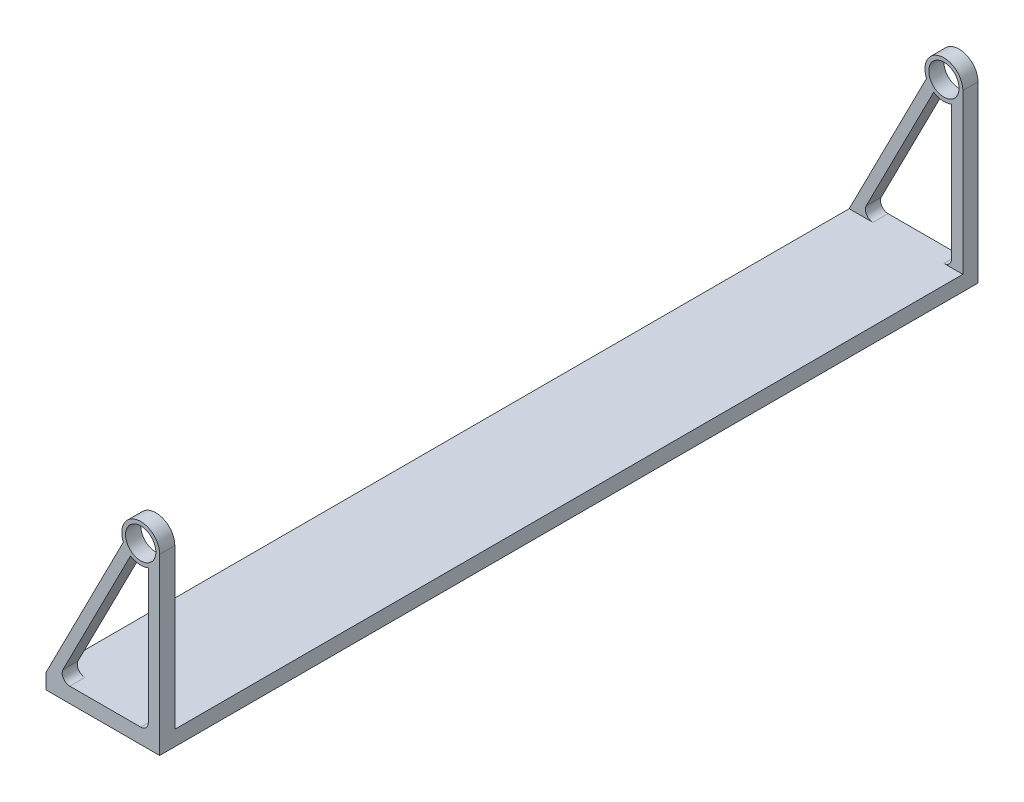
ISO-10303-21;
HEADER;
FILE_DESCRIPTION(('STEP AP214'),'2;1');
FILE_NAME('part.step','',(''),(''),'','','');
FILE_SCHEMA(('AUTOMOTIVE_DESIGN { 1 0 10303 214 1 1 1 1 }'));
ENDSEC;
DATA;
#1=APPLICATION_CONTEXT('core data for automotive mechanical design processes');
#2=APPLICATION_PROTOCOL_DEFINITION('international standard','automotive_design',2000,#1);
#3=PRODUCT_CONTEXT('',#1,'mechanical');
#4=PRODUCT('Part','Part','',(#3));
#5=PRODUCT_RELATED_PRODUCT_CATEGORY('part','',(#4));
#6=PRODUCT_DEFINITION_FORMATION('','',#4);
#7=PRODUCT_DEFINITION_CONTEXT('part definition',#1,'design');
#8=PRODUCT_DEFINITION('design','',#6,#7);
#9=PRODUCT_DEFINITION_SHAPE('','',#8);
#10=(LENGTH_UNIT() NAMED_UNIT(*) SI_UNIT(.MILLI.,.METRE.));
#11=(NAMED_UNIT(*) PLANE_ANGLE_UNIT() SI_UNIT($,.RADIAN.));
#12=(NAMED_UNIT(*) SI_UNIT($,.STERADIAN.) SOLID_ANGLE_UNIT());
#13=UNCERTAINTY_MEASURE_WITH_UNIT(LENGTH_MEASURE(1.E-05),#10,'distance_accuracy_value','');
#14=(GEOMETRIC_REPRESENTATION_CONTEXT(3) GLOBAL_UNCERTAINTY_ASSIGNED_CONTEXT((#13)) GLOBAL_UNIT_ASSIGNED_CONTEXT((#10,
#11,#12)) REPRESENTATION_CONTEXT('',''));
#15=CARTESIAN_POINT('',(0.,0.,0.));
#16=DIRECTION('',(0.,0.,1.));
#17=DIRECTION('',(1.,0.,0.));
#18=AXIS2_PLACEMENT_3D('',#15,#16,#17);
#19=CARTESIAN_POINT('',(0.,50.8,0.));
#20=DIRECTION('',(0.,-1.,0.));
#21=DIRECTION('',(0.,0.,-1.));
#22=AXIS2_PLACEMENT_3D('',#19,#20,#21);
#23=PLANE('',#22);
#24=DIRECTION('',(-1.,0.,0.));
#25=VECTOR('',#24,1.);
#26=CARTESIAN_POINT('',(0.,50.7999999999999,-1320.8));
#27=LINE('',#26,#25);
#28=CARTESIAN_POINT('',(190.5,50.8,-1320.8));
#29=VERTEX_POINT('',#28);
#30=CARTESIAN_POINT('',(127.,50.8,-1320.8));
#31=VERTEX_POINT('',#30);
#32=EDGE_CURVE('E218',#29,#31,#27,.T.);
#33=ORIENTED_EDGE('',*,*,#32,.T.);
#34=DIRECTION('',(0.,0.,-1.));
#35=VECTOR('',#34,1.);
#36=CARTESIAN_POINT('',(127.,50.8,0.));
#37=LINE('',#36,#35);
#38=CARTESIAN_POINT('',(127.,50.8,-1371.6));
#39=VERTEX_POINT('',#38);
#40=EDGE_CURVE('E326',#31,#39,#37,.T.);
#41=ORIENTED_EDGE('',*,*,#40,.T.);
#42=DIRECTION('',(-1.,0.,0.));
#43=VECTOR('',#42,1.);
#44=CARTESIAN_POINT('',(-190.5,50.8,-1371.6));
#45=LINE('',#44,#43);
#46=CARTESIAN_POINT('',(-110.90197212341,50.8,-1371.6));
#47=VERTEX_POINT('',#46);
#48=EDGE_CURVE('E187',#39,#47,#45,.T.);
#49=ORIENTED_EDGE('',*,*,#48,.T.);
#50=DIRECTION('',(0.,0.,-1.));
#51=VECTOR('',#50,1.);
#52=CARTESIAN_POINT('',(-110.90197212341,50.8,-1320.8));
#53=LINE('',#52,#51);
#54=CARTESIAN_POINT('',(-110.90197212341,50.8,-1320.8));
#55=VERTEX_POINT('',#54);
#56=EDGE_CURVE('E193',#47,#55,#53,.F.);
#57=ORIENTED_EDGE('',*,*,#56,.T.);
#58=DIRECTION('',(1.,0.,0.));
#59=VECTOR('',#58,1.);
#60=CARTESIAN_POINT('',(0.,50.8,-1320.8));
#61=LINE('',#60,#59);
#62=CARTESIAN_POINT('',(-190.5,50.8,-1320.8));
#63=VERTEX_POINT('',#62);
#64=EDGE_CURVE('E190',#63,#55,#61,.T.);
#65=ORIENTED_EDGE('',*,*,#64,.F.);
#66=DIRECTION('',(0.,0.,1.));
#67=VECTOR('',#66,1.);
#68=CARTESIAN_POINT('',(-190.5,50.8,1371.6));
#69=LINE('',#68,#67);
#70=CARTESIAN_POINT('',(-190.5,50.8,1320.8));
#71=VERTEX_POINT('',#70);
#72=EDGE_CURVE('E176',#63,#71,#69,.T.);
#73=ORIENTED_EDGE('',*,*,#72,.T.);
#74=DIRECTION('',(1.,0.,0.));
#75=VECTOR('',#74,1.);
#76=CARTESIAN_POINT('',(0.,50.8,1320.8));
#77=LINE('',#76,#75);
#78=CARTESIAN_POINT('',(-110.90197212341,50.8,1320.8));
#79=VERTEX_POINT('',#78);
#80=EDGE_CURVE('E265',#71,#79,#77,.T.);
#81=ORIENTED_EDGE('',*,*,#80,.T.);
#82=DIRECTION('',(0.,0.,1.));
#83=VECTOR('',#82,1.);
#84=CARTESIAN_POINT('',(-110.90197212341,50.8,0.));
#85=LINE('',#84,#83);
#86=CARTESIAN_POINT('',(-110.90197212341,50.8,1371.6));
#87=VERTEX_POINT('',#86);
#88=EDGE_CURVE('E322',#79,#87,#85,.T.);
#89=ORIENTED_EDGE('',*,*,#88,.T.);
#90=DIRECTION('',(1.,0.,0.));
#91=VECTOR('',#90,1.);
#92=CARTESIAN_POINT('',(-190.5,50.8,1371.6));
#93=LINE('',#92,#91);
#94=CARTESIAN_POINT('',(127.,50.8,1371.6));
#95=VERTEX_POINT('',#94);
#96=EDGE_CURVE('E205',#87,#95,#93,.T.);
#97=ORIENTED_EDGE('',*,*,#96,.T.);
#98=DIRECTION('',(0.,0.,1.));
#99=VECTOR('',#98,1.);
#100=CARTESIAN_POINT('',(127.,50.8,1320.8));
#101=LINE('',#100,#99);
#102=CARTESIAN_POINT('',(127.,50.8,1320.8));
#103=VERTEX_POINT('',#102);
#104=EDGE_CURVE('E319',#95,#103,#101,.F.);
#105=ORIENTED_EDGE('',*,*,#104,.T.);
#106=DIRECTION('',(-1.,0.,0.));
#107=VECTOR('',#106,1.);
#108=CARTESIAN_POINT('',(0.,50.7999999999999,1320.8));
#109=LINE('',#108,#107);
#110=CARTESIAN_POINT('',(190.5,50.8,1320.8));
#111=VERTEX_POINT('',#110);
#112=EDGE_CURVE('E258',#111,#103,#109,.T.);
#113=ORIENTED_EDGE('',*,*,#112,.F.);
#114=DIRECTION('',(0.,0.,-1.));
#115=VECTOR('',#114,1.);
#116=CARTESIAN_POINT('',(190.5,50.8,1371.6));
#117=LINE('',#116,#115);
#118=EDGE_CURVE('E295',#111,#29,#117,.T.);
#119=ORIENTED_EDGE('',*,*,#118,.T.);
#120=EDGE_LOOP('',(#33,#41,#49,#57,#65,#73,#81,#89,#97,#105,#113,#119));
#121=FACE_BOUND('',#120,.T.);
#122=ADVANCED_FACE('F35',(#121),#23,.F.);
#123=CARTESIAN_POINT('',(190.5,50.8,1371.6));
#124=DIRECTION('',(-1.,0.,0.));
#125=DIRECTION('',(0.,0.,1.));
#126=AXIS2_PLACEMENT_3D('',#123,#124,#125);
#127=PLANE('',#126);
#128=DIRECTION('',(0.,0.,-1.));
#129=VECTOR('',#128,1.);
#130=CARTESIAN_POINT('',(190.5,0.,1371.6));
#131=LINE('',#130,#129);
#132=CARTESIAN_POINT('',(190.5,0.,1371.6));
#133=VERTEX_POINT('',#132);
#134=CARTESIAN_POINT('',(190.5,0.,-1371.6));
#135=VERTEX_POINT('',#134);
#136=EDGE_CURVE('E284',#133,#135,#131,.T.);
#137=ORIENTED_EDGE('',*,*,#136,.T.);
#138=DIRECTION('',(0.,-1.,0.));
#139=VECTOR('',#138,1.);
#140=CARTESIAN_POINT('',(190.5,50.8,-1371.6));
#141=LINE('',#140,#139);
#142=CARTESIAN_POINT('',(190.5,584.2,-1371.6));
#143=VERTEX_POINT('',#142);
#144=EDGE_CURVE('E316',#143,#135,#141,.T.);
#145=ORIENTED_EDGE('',*,*,#144,.F.);
#146=DIRECTION('',(0.,0.,-1.));
#147=VECTOR('',#146,1.);
#148=CARTESIAN_POINT('',(190.5,584.2,-1320.8));
#149=LINE('',#148,#147);
#150=CARTESIAN_POINT('',(190.5,584.2,-1320.8));
#151=VERTEX_POINT('',#150);
#152=EDGE_CURVE('E245',#151,#143,#149,.T.);
#153=ORIENTED_EDGE('',*,*,#152,.F.);
#154=DIRECTION('',(0.,1.,0.));
#155=VECTOR('',#154,1.);
#156=CARTESIAN_POINT('',(190.5,0.,-1320.8));
#157=LINE('',#156,#155);
#158=EDGE_CURVE('E212',#29,#151,#157,.T.);
#159=ORIENTED_EDGE('',*,*,#158,.F.);
#160=ORIENTED_EDGE('',*,*,#118,.F.);
#161=DIRECTION('',(0.,1.,0.));
#162=VECTOR('',#161,1.);
#163=CARTESIAN_POINT('',(190.5,0.,1320.8));
#164=LINE('',#163,#162);
#165=CARTESIAN_POINT('',(190.5,584.2,1320.8));
#166=VERTEX_POINT('',#165);
#167=EDGE_CURVE('E260',#111,#166,#164,.T.);
#168=ORIENTED_EDGE('',*,*,#167,.T.);
#169=DIRECTION('',(0.,0.,1.));
#170=VECTOR('',#169,1.);
#171=CARTESIAN_POINT('',(190.5,584.2,1320.8));
#172=LINE('',#171,#170);
#173=CARTESIAN_POINT('',(190.5,584.2,1371.6));
#174=VERTEX_POINT('',#173);
#175=EDGE_CURVE('E287',#166,#174,#172,.T.);
#176=ORIENTED_EDGE('',*,*,#175,.T.);
#177=DIRECTION('',(0.,-1.,0.));
#178=VECTOR('',#177,1.);
#179=CARTESIAN_POINT('',(190.5,50.8,1371.6));
#180=LINE('',#179,#178);
#181=EDGE_CURVE('E301',#174,#133,#180,.T.);
#182=ORIENTED_EDGE('',*,*,#181,.T.);
#183=EDGE_LOOP('',(#137,#145,#153,#159,#160,#168,#176,#182));
#184=FACE_BOUND('',#183,.T.);
#185=ADVANCED_FACE('F388',(#184),#127,.F.);
#186=CARTESIAN_POINT('',(-190.5,50.8,-1371.6));
#187=DIRECTION('',(0.,0.,1.));
#188=DIRECTION('',(1.,0.,0.));
#189=AXIS2_PLACEMENT_3D('',#186,#187,#188);
#190=PLANE('',#189);
#191=ORIENTED_EDGE('',*,*,#48,.F.);
#192=CARTESIAN_POINT('',(127.,76.2,-1371.6));
#193=DIRECTION('',(0.,0.,1.));
#194=DIRECTION('',(1.,0.,0.));
#195=AXIS2_PLACEMENT_3D('',#192,#193,#194);
#196=CIRCLE('',#195,25.4);
#197=CARTESIAN_POINT('',(152.4,76.2,-1371.6));
#198=VERTEX_POINT('',#197);
#199=EDGE_CURVE('E338',#39,#198,#196,.T.);
#200=ORIENTED_EDGE('',*,*,#199,.T.);
#201=DIRECTION('',(0.,1.,0.));
#202=VECTOR('',#201,1.);
#203=CARTESIAN_POINT('',(152.4,0.,-1371.6));
#204=LINE('',#203,#202);
#205=CARTESIAN_POINT('',(152.4,526.001288674061,-1371.6));
#206=VERTEX_POINT('',#205);
#207=EDGE_CURVE('E232',#198,#206,#204,.T.);
#208=ORIENTED_EDGE('',*,*,#207,.T.);
#209=CARTESIAN_POINT('',(127.,584.2,-1371.6));
#210=DIRECTION('',(0.,0.,1.));
#211=DIRECTION('',(1.,0.,0.));
#212=AXIS2_PLACEMENT_3D('',#209,#210,#211);
#213=CIRCLE('',#212,63.5);
#214=CARTESIAN_POINT('',(92.7668359761249,530.717848950192,-1371.6));
#215=VERTEX_POINT('',#214);
#216=EDGE_CURVE('E233',#215,#206,#213,.T.);
#217=ORIENTED_EDGE('',*,*,#216,.F.);
#218=DIRECTION('',(0.454927866871508,0.89052829036687,0.));
#219=VECTOR('',#218,1.);
#220=CARTESIAN_POINT('',(-141.439800602513,72.2547587481184,-1371.6));
#221=LINE('',#220,#219);
#222=CARTESIAN_POINT('',(-133.521390698729,87.7551678185363,-1371.6));
#223=VERTEX_POINT('',#222);
#224=EDGE_CURVE('E226',#223,#215,#221,.T.);
#225=ORIENTED_EDGE('',*,*,#224,.F.);
#226=CARTESIAN_POINT('',(-110.90197212341,76.2,-1371.6));
#227=DIRECTION('',(0.,0.,1.));
#228=DIRECTION('',(1.,0.,0.));
#229=AXIS2_PLACEMENT_3D('',#226,#227,#228);
#230=CIRCLE('',#229,25.4);
#231=EDGE_CURVE('E343',#223,#47,#230,.T.);
#232=ORIENTED_EDGE('',*,*,#231,.T.);
#233=EDGE_LOOP('',(#191,#200,#208,#217,#225,#232));
#234=FACE_BOUND('',#233,.T.);
#235=DIRECTION('',(-1.,0.,0.));
#236=VECTOR('',#235,1.);
#237=CARTESIAN_POINT('',(-190.5,0.,-1371.6));
#238=LINE('',#237,#236);
#239=CARTESIAN_POINT('',(-190.5,0.,-1371.6));
#240=VERTEX_POINT('',#239);
#241=EDGE_CURVE('E304',#135,#240,#238,.T.);
#242=ORIENTED_EDGE('',*,*,#241,.T.);
#243=DIRECTION('',(0.,-1.,0.));
#244=VECTOR('',#243,1.);
#245=CARTESIAN_POINT('',(-190.5,50.8,-1371.6));
#246=LINE('',#245,#244);
#247=CARTESIAN_POINT('',(-190.5,50.8,-1371.6));
#248=VERTEX_POINT('',#247);
#249=EDGE_CURVE('E314',#248,#240,#246,.T.);
#250=ORIENTED_EDGE('',*,*,#249,.F.);
#251=DIRECTION('',(0.454927866871508,0.89052829036687,0.));
#252=VECTOR('',#251,1.);
#253=CARTESIAN_POINT('',(-171.654648831969,87.6900645116334,-1371.6));
#254=LINE('',#253,#252);
#255=CARTESIAN_POINT('',(68.8989410420002,558.577413324197,-1371.6));
#256=VERTEX_POINT('',#255);
#257=EDGE_CURVE('E204',#248,#256,#254,.T.);
#258=ORIENTED_EDGE('',*,*,#257,.T.);
#259=EDGE_CURVE('E229',#143,#256,#213,.T.);
#260=ORIENTED_EDGE('',*,*,#259,.F.);
#261=ORIENTED_EDGE('',*,*,#144,.T.);
#262=EDGE_LOOP('',(#242,#250,#258,#260,#261));
#263=FACE_BOUND('',#262,.T.);
#264=CARTESIAN_POINT('',(127.,584.2,-1371.6));
#265=DIRECTION('',(0.,0.,1.));
#266=DIRECTION('',(1.,0.,0.));
#267=AXIS2_PLACEMENT_3D('',#264,#265,#266);
#268=CIRCLE('',#267,50.8);
#269=CARTESIAN_POINT('',(177.8,584.2,-1371.6));
#270=VERTEX_POINT('',#269);
#271=EDGE_CURVE('E235',#270,#270,#268,.T.);
#272=ORIENTED_EDGE('',*,*,#271,.T.);
#273=EDGE_LOOP('',(#272));
#274=FACE_BOUND('',#273,.T.);
#275=ADVANCED_FACE('F403',(#234,#263,#274),#190,.F.);
#276=CARTESIAN_POINT('',(-190.5,50.8,1371.6));
#277=DIRECTION('',(1.,0.,0.));
#278=DIRECTION('',(0.,0.,-1.));
#279=AXIS2_PLACEMENT_3D('',#276,#277,#278);
#280=PLANE('',#279);
#281=DIRECTION('',(0.,0.,1.));
#282=VECTOR('',#281,1.);
#283=CARTESIAN_POINT('',(-190.5,0.,1371.6));
#284=LINE('',#283,#282);
#285=CARTESIAN_POINT('',(-190.5,0.,1371.6));
#286=VERTEX_POINT('',#285);
#287=EDGE_CURVE('E306',#240,#286,#284,.T.);
#288=ORIENTED_EDGE('',*,*,#287,.T.);
#289=DIRECTION('',(0.,-1.,0.));
#290=VECTOR('',#289,1.);
#291=CARTESIAN_POINT('',(-190.5,50.8,1371.6));
#292=LINE('',#291,#290);
#293=CARTESIAN_POINT('',(-190.5,50.8,1371.6));
#294=VERTEX_POINT('',#293);
#295=EDGE_CURVE('E311',#294,#286,#292,.T.);
#296=ORIENTED_EDGE('',*,*,#295,.F.);
#297=DIRECTION('',(0.,0.,1.));
#298=VECTOR('',#297,1.);
#299=CARTESIAN_POINT('',(-190.5,50.8,1320.8));
#300=LINE('',#299,#298);
#301=EDGE_CURVE('E184',#71,#294,#300,.T.);
#302=ORIENTED_EDGE('',*,*,#301,.F.);
#303=ORIENTED_EDGE('',*,*,#72,.F.);
#304=EDGE_CURVE('E181',#248,#63,#69,.T.);
#305=ORIENTED_EDGE('',*,*,#304,.F.);
#306=ORIENTED_EDGE('',*,*,#249,.T.);
#307=EDGE_LOOP('',(#288,#296,#302,#303,#305,#306));
#308=FACE_BOUND('',#307,.T.);
#309=ADVANCED_FACE('F178',(#308),#280,.F.);
#310=CARTESIAN_POINT('',(-190.5,50.8,1371.6));
#311=DIRECTION('',(0.,0.,-1.));
#312=DIRECTION('',(-1.,0.,0.));
#313=AXIS2_PLACEMENT_3D('',#310,#311,#312);
#314=PLANE('',#313);
#315=DIRECTION('',(0.,1.,0.));
#316=VECTOR('',#315,1.);
#317=CARTESIAN_POINT('',(152.4,0.,1371.6));
#318=LINE('',#317,#316);
#319=CARTESIAN_POINT('',(152.4,76.2,1371.6));
#320=VERTEX_POINT('',#319);
#321=CARTESIAN_POINT('',(152.4,526.001288674061,1371.6));
#322=VERTEX_POINT('',#321);
#323=EDGE_CURVE('E275',#320,#322,#318,.T.);
#324=ORIENTED_EDGE('',*,*,#323,.F.);
#325=CARTESIAN_POINT('',(127.,76.2,1371.6));
#326=DIRECTION('',(0.,0.,-1.));
#327=DIRECTION('',(-1.,0.,0.));
#328=AXIS2_PLACEMENT_3D('',#325,#326,#327);
#329=CIRCLE('',#328,25.4);
#330=EDGE_CURVE('E43',#320,#95,#329,.T.);
#331=ORIENTED_EDGE('',*,*,#330,.T.);
#332=ORIENTED_EDGE('',*,*,#96,.F.);
#333=CARTESIAN_POINT('',(-110.90197212341,76.2,1371.6));
#334=DIRECTION('',(0.,0.,-1.));
#335=DIRECTION('',(-1.,0.,0.));
#336=AXIS2_PLACEMENT_3D('',#333,#334,#335);
#337=CIRCLE('',#336,25.4);
#338=CARTESIAN_POINT('',(-133.521390698729,87.7551678185363,1371.6));
#339=VERTEX_POINT('',#338);
#340=EDGE_CURVE('E347',#87,#339,#337,.T.);
#341=ORIENTED_EDGE('',*,*,#340,.T.);
#342=DIRECTION('',(0.454927866871508,0.89052829036687,0.));
#343=VECTOR('',#342,1.);
#344=CARTESIAN_POINT('',(-141.439800602513,72.2547587481184,1371.6));
#345=LINE('',#344,#343);
#346=CARTESIAN_POINT('',(92.7668359761249,530.717848950192,1371.6));
#347=VERTEX_POINT('',#346);
#348=EDGE_CURVE('E241',#339,#347,#345,.T.);
#349=ORIENTED_EDGE('',*,*,#348,.T.);
#350=CARTESIAN_POINT('',(127.,584.2,1371.6));
#351=DIRECTION('',(0.,0.,1.));
#352=DIRECTION('',(1.,0.,0.));
#353=AXIS2_PLACEMENT_3D('',#350,#351,#352);
#354=CIRCLE('',#353,63.5);
#355=EDGE_CURVE('E272',#347,#322,#354,.T.);
#356=ORIENTED_EDGE('',*,*,#355,.T.);
#357=EDGE_LOOP('',(#324,#331,#332,#341,#349,#356));
#358=FACE_BOUND('',#357,.T.);
#359=DIRECTION('',(1.,0.,0.));
#360=VECTOR('',#359,1.);
#361=CARTESIAN_POINT('',(-190.5,0.,1371.6));
#362=LINE('',#361,#360);
#363=EDGE_CURVE('E297',#286,#133,#362,.T.);
#364=ORIENTED_EDGE('',*,*,#363,.T.);
#365=ORIENTED_EDGE('',*,*,#181,.F.);
#366=CARTESIAN_POINT('',(68.8989410420002,558.577413324197,1371.6));
#367=VERTEX_POINT('',#366);
#368=EDGE_CURVE('E276',#174,#367,#354,.T.);
#369=ORIENTED_EDGE('',*,*,#368,.T.);
#370=DIRECTION('',(0.454927866871508,0.89052829036687,0.));
#371=VECTOR('',#370,1.);
#372=CARTESIAN_POINT('',(-171.654648831969,87.6900645116334,1371.6));
#373=LINE('',#372,#371);
#374=EDGE_CURVE('E278',#294,#367,#373,.T.);
#375=ORIENTED_EDGE('',*,*,#374,.F.);
#376=ORIENTED_EDGE('',*,*,#295,.T.);
#377=EDGE_LOOP('',(#364,#365,#369,#375,#376));
#378=FACE_BOUND('',#377,.T.);
#379=CARTESIAN_POINT('',(127.,584.2,1371.6));
#380=DIRECTION('',(0.,0.,1.));
#381=DIRECTION('',(1.,0.,0.));
#382=AXIS2_PLACEMENT_3D('',#379,#380,#381);
#383=CIRCLE('',#382,50.8);
#384=CARTESIAN_POINT('',(177.8,584.2,1371.6));
#385=VERTEX_POINT('',#384);
#386=EDGE_CURVE('E252',#385,#385,#383,.T.);
#387=ORIENTED_EDGE('',*,*,#386,.F.);
#388=EDGE_LOOP('',(#387));
#389=FACE_BOUND('',#388,.T.);
#390=ADVANCED_FACE('F354',(#358,#378,#389),#314,.F.);
#391=CARTESIAN_POINT('',(0.,0.,0.));
#392=DIRECTION('',(0.,-1.,0.));
#393=DIRECTION('',(0.,0.,-1.));
#394=AXIS2_PLACEMENT_3D('',#391,#392,#393);
#395=PLANE('',#394);
#396=ORIENTED_EDGE('',*,*,#136,.F.);
#397=ORIENTED_EDGE('',*,*,#363,.F.);
#398=ORIENTED_EDGE('',*,*,#287,.F.);
#399=ORIENTED_EDGE('',*,*,#241,.F.);
#400=EDGE_LOOP('',(#396,#397,#398,#399));
#401=FACE_BOUND('',#400,.T.);
#402=ADVANCED_FACE('F441',(#401),#395,.T.);
#403=CARTESIAN_POINT('',(-141.439800602513,72.2547587481184,1320.8));
#404=DIRECTION('',(0.89052829036687,-0.454927866871508,0.));
#405=DIRECTION('',(0.454927866871508,0.89052829036687,0.));
#406=AXIS2_PLACEMENT_3D('',#403,#404,#405);
#407=PLANE('',#406);
#408=ORIENTED_EDGE('',*,*,#348,.F.);
#409=DIRECTION('',(0.,0.,1.));
#410=VECTOR('',#409,1.);
#411=CARTESIAN_POINT('',(-133.521390698729,87.7551678185363,1320.8));
#412=LINE('',#411,#410);
#413=CARTESIAN_POINT('',(-133.521390698729,87.7551678185363,1320.8));
#414=VERTEX_POINT('',#413);
#415=EDGE_CURVE('E334',#339,#414,#412,.F.);
#416=ORIENTED_EDGE('',*,*,#415,.T.);
#417=DIRECTION('',(0.454927866871508,0.89052829036687,0.));
#418=VECTOR('',#417,1.);
#419=CARTESIAN_POINT('',(-141.439800602513,72.2547587481184,1320.8));
#420=LINE('',#419,#418);
#421=CARTESIAN_POINT('',(92.7668359761249,530.717848950192,1320.8));
#422=VERTEX_POINT('',#421);
#423=EDGE_CURVE('E249',#414,#422,#420,.T.);
#424=ORIENTED_EDGE('',*,*,#423,.T.);
#425=DIRECTION('',(0.,0.,1.));
#426=VECTOR('',#425,1.);
#427=CARTESIAN_POINT('',(92.7668359761249,530.717848950192,1320.8));
#428=LINE('',#427,#426);
#429=EDGE_CURVE('E270',#422,#347,#428,.T.);
#430=ORIENTED_EDGE('',*,*,#429,.T.);
#431=EDGE_LOOP('',(#408,#416,#424,#430));
#432=FACE_BOUND('',#431,.T.);
#433=ADVANCED_FACE('F371',(#432),#407,.T.);
#434=CARTESIAN_POINT('',(-171.654648831969,87.6900645116334,1320.8));
#435=DIRECTION('',(0.89052829036687,-0.454927866871507,0.));
#436=DIRECTION('',(0.454927866871508,0.89052829036687,0.));
#437=AXIS2_PLACEMENT_3D('',#434,#435,#436);
#438=PLANE('',#437);
#439=ORIENTED_EDGE('',*,*,#374,.T.);
#440=DIRECTION('',(0.,0.,1.));
#441=VECTOR('',#440,1.);
#442=CARTESIAN_POINT('',(68.8989410420002,558.577413324197,1320.8));
#443=LINE('',#442,#441);
#444=CARTESIAN_POINT('',(68.8989410420002,558.577413324197,1320.8));
#445=VERTEX_POINT('',#444);
#446=EDGE_CURVE('E285',#445,#367,#443,.T.);
#447=ORIENTED_EDGE('',*,*,#446,.F.);
#448=DIRECTION('',(0.454927866871508,0.89052829036687,0.));
#449=VECTOR('',#448,1.);
#450=CARTESIAN_POINT('',(-171.654648831969,87.6900645116334,1320.8));
#451=LINE('',#450,#449);
#452=EDGE_CURVE('E263',#71,#445,#451,.T.);
#453=ORIENTED_EDGE('',*,*,#452,.F.);
#454=ORIENTED_EDGE('',*,*,#301,.T.);
#455=EDGE_LOOP('',(#439,#447,#453,#454));
#456=FACE_BOUND('',#455,.T.);
#457=ADVANCED_FACE('F381',(#456),#438,.F.);
#458=CARTESIAN_POINT('',(127.,584.2,1320.8));
#459=DIRECTION('',(0.,0.,1.));
#460=DIRECTION('',(1.,0.,0.));
#461=AXIS2_PLACEMENT_3D('',#458,#459,#460);
#462=CYLINDRICAL_SURFACE('',#461,63.5);
#463=ORIENTED_EDGE('',*,*,#368,.F.);
#464=ORIENTED_EDGE('',*,*,#175,.F.);
#465=CARTESIAN_POINT('',(127.,584.2,1320.8));
#466=DIRECTION('',(0.,0.,1.));
#467=DIRECTION('',(1.,0.,0.));
#468=AXIS2_PLACEMENT_3D('',#465,#466,#467);
#469=CIRCLE('',#468,63.5);
#470=EDGE_CURVE('E256',#166,#445,#469,.T.);
#471=ORIENTED_EDGE('',*,*,#470,.T.);
#472=ORIENTED_EDGE('',*,*,#446,.T.);
#473=EDGE_LOOP('',(#463,#464,#471,#472));
#474=FACE_BOUND('',#473,.T.);
#475=ADVANCED_FACE('F386',(#474),#462,.T.);
#476=CARTESIAN_POINT('',(152.4,0.,1320.8));
#477=DIRECTION('',(1.,0.,0.));
#478=DIRECTION('',(0.,0.,-1.));
#479=AXIS2_PLACEMENT_3D('',#476,#477,#478);
#480=PLANE('',#479);
#481=DIRECTION('',(0.,1.,0.));
#482=VECTOR('',#481,1.);
#483=CARTESIAN_POINT('',(152.4,0.,1320.8));
#484=LINE('',#483,#482);
#485=CARTESIAN_POINT('',(152.4,76.2,1320.8));
#486=VERTEX_POINT('',#485);
#487=CARTESIAN_POINT('',(152.4,526.001288674061,1320.8));
#488=VERTEX_POINT('',#487);
#489=EDGE_CURVE('E255',#486,#488,#484,.T.);
#490=ORIENTED_EDGE('',*,*,#489,.F.);
#491=DIRECTION('',(0.,0.,1.));
#492=VECTOR('',#491,1.);
#493=CARTESIAN_POINT('',(152.4,76.2,1371.6));
#494=LINE('',#493,#492);
#495=EDGE_CURVE('E336',#486,#320,#494,.T.);
#496=ORIENTED_EDGE('',*,*,#495,.T.);
#497=ORIENTED_EDGE('',*,*,#323,.T.);
#498=DIRECTION('',(0.,0.,1.));
#499=VECTOR('',#498,1.);
#500=CARTESIAN_POINT('',(152.4,526.001288674061,1320.8));
#501=LINE('',#500,#499);
#502=EDGE_CURVE('E290',#488,#322,#501,.T.);
#503=ORIENTED_EDGE('',*,*,#502,.F.);
#504=EDGE_LOOP('',(#490,#496,#497,#503));
#505=FACE_BOUND('',#504,.T.);
#506=ADVANCED_FACE('F358',(#505),#480,.F.);
#507=ORIENTED_EDGE('',*,*,#355,.F.);
#508=ORIENTED_EDGE('',*,*,#429,.F.);
#509=EDGE_CURVE('E251',#422,#488,#469,.T.);
#510=ORIENTED_EDGE('',*,*,#509,.T.);
#511=ORIENTED_EDGE('',*,*,#502,.T.);
#512=EDGE_LOOP('',(#507,#508,#510,#511));
#513=FACE_BOUND('',#512,.T.);
#514=ADVANCED_FACE('F368',(#513),#462,.T.);
#515=CARTESIAN_POINT('',(127.,584.2,1320.8));
#516=DIRECTION('',(0.,0.,1.));
#517=DIRECTION('',(1.,0.,0.));
#518=AXIS2_PLACEMENT_3D('',#515,#516,#517);
#519=CYLINDRICAL_SURFACE('',#518,50.8);
#520=CARTESIAN_POINT('',(127.,584.2,1320.8));
#521=DIRECTION('',(0.,0.,1.));
#522=DIRECTION('',(1.,0.,0.));
#523=AXIS2_PLACEMENT_3D('',#520,#521,#522);
#524=CIRCLE('',#523,50.8);
#525=CARTESIAN_POINT('',(177.8,584.2,1320.8));
#526=VERTEX_POINT('',#525);
#527=EDGE_CURVE('E267',#526,#526,#524,.T.);
#528=ORIENTED_EDGE('',*,*,#527,.F.);
#529=EDGE_LOOP('',(#528));
#530=FACE_BOUND('',#529,.T.);
#531=ORIENTED_EDGE('',*,*,#386,.T.);
#532=EDGE_LOOP('',(#531));
#533=FACE_BOUND('',#532,.T.);
#534=ADVANCED_FACE('F511',(#530,#533),#519,.F.);
#535=CARTESIAN_POINT('',(0.,0.,1320.8));
#536=DIRECTION('',(0.,0.,1.));
#537=DIRECTION('',(1.,0.,0.));
#538=AXIS2_PLACEMENT_3D('',#535,#536,#537);
#539=PLANE('',#538);
#540=ORIENTED_EDGE('',*,*,#423,.F.);
#541=CARTESIAN_POINT('',(-110.90197212341,76.2,1320.8));
#542=DIRECTION('',(0.,0.,1.));
#543=DIRECTION('',(1.,0.,0.));
#544=AXIS2_PLACEMENT_3D('',#541,#542,#543);
#545=CIRCLE('',#544,25.4);
#546=EDGE_CURVE('E349',#414,#79,#545,.T.);
#547=ORIENTED_EDGE('',*,*,#546,.T.);
#548=ORIENTED_EDGE('',*,*,#80,.F.);
#549=ORIENTED_EDGE('',*,*,#452,.T.);
#550=ORIENTED_EDGE('',*,*,#470,.F.);
#551=ORIENTED_EDGE('',*,*,#167,.F.);
#552=ORIENTED_EDGE('',*,*,#112,.T.);
#553=CARTESIAN_POINT('',(127.,76.2,1320.8));
#554=DIRECTION('',(0.,0.,1.));
#555=DIRECTION('',(1.,0.,0.));
#556=AXIS2_PLACEMENT_3D('',#553,#554,#555);
#557=CIRCLE('',#556,25.4);
#558=EDGE_CURVE('E11',#103,#486,#557,.T.);
#559=ORIENTED_EDGE('',*,*,#558,.T.);
#560=ORIENTED_EDGE('',*,*,#489,.T.);
#561=ORIENTED_EDGE('',*,*,#509,.F.);
#562=EDGE_LOOP('',(#540,#547,#548,#549,#550,#551,#552,#559,#560,#561));
#563=FACE_BOUND('',#562,.T.);
#564=ORIENTED_EDGE('',*,*,#527,.T.);
#565=EDGE_LOOP('',(#564));
#566=FACE_BOUND('',#565,.T.);
#567=ADVANCED_FACE('F362',(#563,#566),#539,.F.);
#568=CARTESIAN_POINT('',(-141.439800602513,72.2547587481184,-1320.8));
#569=DIRECTION('',(-0.89052829036687,0.454927866871508,0.));
#570=DIRECTION('',(-0.454927866871508,-0.89052829036687,0.));
#571=AXIS2_PLACEMENT_3D('',#568,#569,#570);
#572=PLANE('',#571);
#573=DIRECTION('',(0.454927866871508,0.89052829036687,0.));
#574=VECTOR('',#573,1.);
#575=CARTESIAN_POINT('',(-141.439800602513,72.2547587481184,-1320.8));
#576=LINE('',#575,#574);
#577=CARTESIAN_POINT('',(-133.521390698729,87.7551678185363,-1320.8));
#578=VERTEX_POINT('',#577);
#579=CARTESIAN_POINT('',(92.7668359761249,530.717848950192,-1320.8));
#580=VERTEX_POINT('',#579);
#581=EDGE_CURVE('E198',#578,#580,#576,.T.);
#582=ORIENTED_EDGE('',*,*,#581,.F.);
#583=DIRECTION('',(0.,0.,-1.));
#584=VECTOR('',#583,1.);
#585=CARTESIAN_POINT('',(-133.521390698729,87.7551678185363,-1371.6));
#586=LINE('',#585,#584);
#587=EDGE_CURVE('E331',#578,#223,#586,.T.);
#588=ORIENTED_EDGE('',*,*,#587,.T.);
#589=ORIENTED_EDGE('',*,*,#224,.T.);
#590=DIRECTION('',(0.,0.,-1.));
#591=VECTOR('',#590,1.);
#592=CARTESIAN_POINT('',(92.7668359761249,530.717848950192,-1320.8));
#593=LINE('',#592,#591);
#594=EDGE_CURVE('E238',#580,#215,#593,.T.);
#595=ORIENTED_EDGE('',*,*,#594,.F.);
#596=EDGE_LOOP('',(#582,#588,#589,#595));
#597=FACE_BOUND('',#596,.T.);
#598=ADVANCED_FACE('F413',(#597),#572,.F.);
#599=CARTESIAN_POINT('',(127.,584.2,-1320.8));
#600=DIRECTION('',(0.,0.,-1.));
#601=DIRECTION('',(-1.,0.,0.));
#602=AXIS2_PLACEMENT_3D('',#599,#600,#601);
#603=CYLINDRICAL_SURFACE('',#602,63.5);
#604=ORIENTED_EDGE('',*,*,#216,.T.);
#605=DIRECTION('',(0.,0.,-1.));
#606=VECTOR('',#605,1.);
#607=CARTESIAN_POINT('',(152.4,526.001288674061,-1320.8));
#608=LINE('',#607,#606);
#609=CARTESIAN_POINT('',(152.4,526.001288674061,-1320.8));
#610=VERTEX_POINT('',#609);
#611=EDGE_CURVE('E242',#610,#206,#608,.T.);
#612=ORIENTED_EDGE('',*,*,#611,.F.);
#613=CARTESIAN_POINT('',(127.,584.2,-1320.8));
#614=DIRECTION('',(0.,0.,1.));
#615=DIRECTION('',(1.,0.,0.));
#616=AXIS2_PLACEMENT_3D('',#613,#614,#615);
#617=CIRCLE('',#616,63.5);
#618=EDGE_CURVE('E214',#580,#610,#617,.T.);
#619=ORIENTED_EDGE('',*,*,#618,.F.);
#620=ORIENTED_EDGE('',*,*,#594,.T.);
#621=EDGE_LOOP('',(#604,#612,#619,#620));
#622=FACE_BOUND('',#621,.T.);
#623=ADVANCED_FACE('F419',(#622),#603,.T.);
#624=CARTESIAN_POINT('',(152.4,0.,-1320.8));
#625=DIRECTION('',(-1.,0.,0.));
#626=DIRECTION('',(0.,0.,1.));
#627=AXIS2_PLACEMENT_3D('',#624,#625,#626);
#628=PLANE('',#627);
#629=ORIENTED_EDGE('',*,*,#207,.F.);
#630=DIRECTION('',(0.,0.,-1.));
#631=VECTOR('',#630,1.);
#632=CARTESIAN_POINT('',(152.4,76.2,-1320.8));
#633=LINE('',#632,#631);
#634=CARTESIAN_POINT('',(152.4,76.2,-1320.8));
#635=VERTEX_POINT('',#634);
#636=EDGE_CURVE('E329',#198,#635,#633,.F.);
#637=ORIENTED_EDGE('',*,*,#636,.T.);
#638=DIRECTION('',(0.,1.,0.));
#639=VECTOR('',#638,1.);
#640=CARTESIAN_POINT('',(152.4,0.,-1320.8));
#641=LINE('',#640,#639);
#642=EDGE_CURVE('E220',#635,#610,#641,.T.);
#643=ORIENTED_EDGE('',*,*,#642,.T.);
#644=ORIENTED_EDGE('',*,*,#611,.T.);
#645=EDGE_LOOP('',(#629,#637,#643,#644));
#646=FACE_BOUND('',#645,.T.);
#647=ADVANCED_FACE('F421',(#646),#628,.T.);
#648=ORIENTED_EDGE('',*,*,#259,.T.);
#649=DIRECTION('',(0.,0.,-1.));
#650=VECTOR('',#649,1.);
#651=CARTESIAN_POINT('',(68.8989410420002,558.577413324197,-1320.8));
#652=LINE('',#651,#650);
#653=CARTESIAN_POINT('',(68.8989410420002,558.577413324197,-1320.8));
#654=VERTEX_POINT('',#653);
#655=EDGE_CURVE('E225',#654,#256,#652,.T.);
#656=ORIENTED_EDGE('',*,*,#655,.F.);
#657=EDGE_CURVE('E209',#151,#654,#617,.T.);
#658=ORIENTED_EDGE('',*,*,#657,.F.);
#659=ORIENTED_EDGE('',*,*,#152,.T.);
#660=EDGE_LOOP('',(#648,#656,#658,#659));
#661=FACE_BOUND('',#660,.T.);
#662=ADVANCED_FACE('F423',(#661),#603,.T.);
#663=CARTESIAN_POINT('',(-171.654648831969,87.6900645116334,-1320.8));
#664=DIRECTION('',(-0.89052829036687,0.454927866871507,0.));
#665=DIRECTION('',(-0.454927866871508,-0.89052829036687,0.));
#666=AXIS2_PLACEMENT_3D('',#663,#664,#665);
#667=PLANE('',#666);
#668=ORIENTED_EDGE('',*,*,#257,.F.);
#669=ORIENTED_EDGE('',*,*,#304,.T.);
#670=DIRECTION('',(0.454927866871508,0.89052829036687,0.));
#671=VECTOR('',#670,1.);
#672=CARTESIAN_POINT('',(-171.654648831969,87.6900645116334,-1320.8));
#673=LINE('',#672,#671);
#674=EDGE_CURVE('E197',#63,#654,#673,.T.);
#675=ORIENTED_EDGE('',*,*,#674,.T.);
#676=ORIENTED_EDGE('',*,*,#655,.T.);
#677=EDGE_LOOP('',(#668,#669,#675,#676));
#678=FACE_BOUND('',#677,.T.);
#679=ADVANCED_FACE('F202',(#678),#667,.T.);
#680=CARTESIAN_POINT('',(127.,584.2,-1320.8));
#681=DIRECTION('',(0.,0.,-1.));
#682=DIRECTION('',(-1.,0.,0.));
#683=AXIS2_PLACEMENT_3D('',#680,#681,#682);
#684=CYLINDRICAL_SURFACE('',#683,50.8);
#685=CARTESIAN_POINT('',(127.,584.2,-1320.8));
#686=DIRECTION('',(0.,0.,1.));
#687=DIRECTION('',(1.,0.,0.));
#688=AXIS2_PLACEMENT_3D('',#685,#686,#687);
#689=CIRCLE('',#688,50.8);
#690=CARTESIAN_POINT('',(177.8,584.2,-1320.8));
#691=VERTEX_POINT('',#690);
#692=EDGE_CURVE('E222',#691,#691,#689,.T.);
#693=ORIENTED_EDGE('',*,*,#692,.T.);
#694=EDGE_LOOP('',(#693));
#695=FACE_BOUND('',#694,.T.);
#696=ORIENTED_EDGE('',*,*,#271,.F.);
#697=EDGE_LOOP('',(#696));
#698=FACE_BOUND('',#697,.T.);
#699=ADVANCED_FACE('F484',(#695,#698),#684,.F.);
#700=CARTESIAN_POINT('',(0.,0.,-1320.8));
#701=DIRECTION('',(0.,0.,-1.));
#702=DIRECTION('',(1.,0.,0.));
#703=AXIS2_PLACEMENT_3D('',#700,#701,#702);
#704=PLANE('',#703);
#705=ORIENTED_EDGE('',*,*,#64,.T.);
#706=CARTESIAN_POINT('',(-110.90197212341,76.2,-1320.8));
#707=DIRECTION('',(0.,0.,-1.));
#708=DIRECTION('',(-1.,0.,0.));
#709=AXIS2_PLACEMENT_3D('',#706,#707,#708);
#710=CIRCLE('',#709,25.4);
#711=EDGE_CURVE('E345',#55,#578,#710,.T.);
#712=ORIENTED_EDGE('',*,*,#711,.T.);
#713=ORIENTED_EDGE('',*,*,#581,.T.);
#714=ORIENTED_EDGE('',*,*,#618,.T.);
#715=ORIENTED_EDGE('',*,*,#642,.F.);
#716=CARTESIAN_POINT('',(127.,76.2,-1320.8));
#717=DIRECTION('',(0.,0.,-1.));
#718=DIRECTION('',(-1.,0.,0.));
#719=AXIS2_PLACEMENT_3D('',#716,#717,#718);
#720=CIRCLE('',#719,25.4);
#721=EDGE_CURVE('E340',#635,#31,#720,.T.);
#722=ORIENTED_EDGE('',*,*,#721,.T.);
#723=ORIENTED_EDGE('',*,*,#32,.F.);
#724=ORIENTED_EDGE('',*,*,#158,.T.);
#725=ORIENTED_EDGE('',*,*,#657,.T.);
#726=ORIENTED_EDGE('',*,*,#674,.F.);
#727=EDGE_LOOP('',(#705,#712,#713,#714,#715,#722,#723,#724,#725,#726));
#728=FACE_BOUND('',#727,.T.);
#729=ORIENTED_EDGE('',*,*,#692,.F.);
#730=EDGE_LOOP('',(#729));
#731=FACE_BOUND('',#730,.T.);
#732=ADVANCED_FACE('F206',(#728,#731),#704,.F.);
#733=CARTESIAN_POINT('',(127.,76.2,0.));
#734=DIRECTION('',(0.,0.,-1.));
#735=DIRECTION('',(-1.,0.,0.));
#736=AXIS2_PLACEMENT_3D('',#733,#734,#735);
#737=CYLINDRICAL_SURFACE('',#736,25.4);
#738=ORIENTED_EDGE('',*,*,#721,.F.);
#739=ORIENTED_EDGE('',*,*,#636,.F.);
#740=ORIENTED_EDGE('',*,*,#199,.F.);
#741=ORIENTED_EDGE('',*,*,#40,.F.);
#742=EDGE_LOOP('',(#738,#739,#740,#741));
#743=FACE_BOUND('',#742,.T.);
#744=ADVANCED_FACE('F400',(#743),#737,.F.);
#745=CARTESIAN_POINT('',(-110.90197212341,76.2,-1320.8));
#746=DIRECTION('',(0.,0.,1.));
#747=DIRECTION('',(1.,0.,0.));
#748=AXIS2_PLACEMENT_3D('',#745,#746,#747);
#749=CYLINDRICAL_SURFACE('',#748,25.4);
#750=ORIENTED_EDGE('',*,*,#711,.F.);
#751=ORIENTED_EDGE('',*,*,#56,.F.);
#752=ORIENTED_EDGE('',*,*,#231,.F.);
#753=ORIENTED_EDGE('',*,*,#587,.F.);
#754=EDGE_LOOP('',(#750,#751,#752,#753));
#755=FACE_BOUND('',#754,.T.);
#756=ADVANCED_FACE('F410',(#755),#749,.F.);
#757=CARTESIAN_POINT('',(-110.90197212341,76.2,0.));
#758=DIRECTION('',(0.,0.,1.));
#759=DIRECTION('',(1.,0.,0.));
#760=AXIS2_PLACEMENT_3D('',#757,#758,#759);
#761=CYLINDRICAL_SURFACE('',#760,25.4);
#762=ORIENTED_EDGE('',*,*,#546,.F.);
#763=ORIENTED_EDGE('',*,*,#415,.F.);
#764=ORIENTED_EDGE('',*,*,#340,.F.);
#765=ORIENTED_EDGE('',*,*,#88,.F.);
#766=EDGE_LOOP('',(#762,#763,#764,#765));
#767=FACE_BOUND('',#766,.T.);
#768=ADVANCED_FACE('F374',(#767),#761,.F.);
#769=CARTESIAN_POINT('',(127.,76.2,1320.8));
#770=DIRECTION('',(0.,0.,-1.));
#771=DIRECTION('',(-1.,0.,0.));
#772=AXIS2_PLACEMENT_3D('',#769,#770,#771);
#773=CYLINDRICAL_SURFACE('',#772,25.4);
#774=ORIENTED_EDGE('',*,*,#558,.F.);
#775=ORIENTED_EDGE('',*,*,#104,.F.);
#776=ORIENTED_EDGE('',*,*,#330,.F.);
#777=ORIENTED_EDGE('',*,*,#495,.F.);
#778=EDGE_LOOP('',(#774,#775,#776,#777));
#779=FACE_BOUND('',#778,.T.);
#780=ADVANCED_FACE('F37',(#779),#773,.F.);
#781=CLOSED_SHELL('',(#122,#185,#275,#309,#390,#402,#433,#457,#475,#506,#514,#534,#567,#598,
#623,#647,#662,#679,#699,#732,#744,#756,#768,#780));
#782=MANIFOLD_SOLID_BREP('B2',#781);
#783=ADVANCED_BREP_SHAPE_REPRESENTATION('',(#18,#782),#14);
#784=SHAPE_DEFINITION_REPRESENTATION(#9,#783);
ENDSEC;
END-ISO-10303-21;
